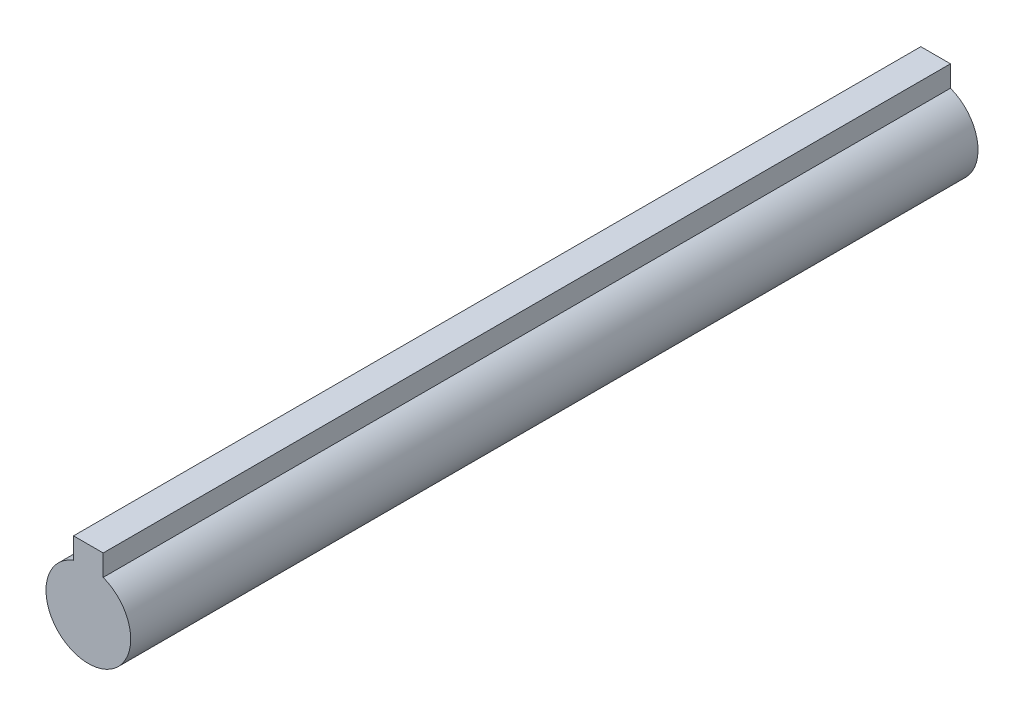
ISO-10303-21;
HEADER;
FILE_DESCRIPTION(('STEP AP214'),'2;1');
FILE_NAME('part.step','',(''),(''),'','','');
FILE_SCHEMA(('AUTOMOTIVE_DESIGN { 1 0 10303 214 1 1 1 1 }'));
ENDSEC;
DATA;
#1=APPLICATION_CONTEXT('core data for automotive mechanical design processes');
#2=APPLICATION_PROTOCOL_DEFINITION('international standard','automotive_design',2000,#1);
#3=PRODUCT_CONTEXT('',#1,'mechanical');
#4=PRODUCT('Part','Part','',(#3));
#5=PRODUCT_RELATED_PRODUCT_CATEGORY('part','',(#4));
#6=PRODUCT_DEFINITION_FORMATION('','',#4);
#7=PRODUCT_DEFINITION_CONTEXT('part definition',#1,'design');
#8=PRODUCT_DEFINITION('design','',#6,#7);
#9=PRODUCT_DEFINITION_SHAPE('','',#8);
#10=(LENGTH_UNIT() NAMED_UNIT(*) SI_UNIT(.MILLI.,.METRE.));
#11=(NAMED_UNIT(*) PLANE_ANGLE_UNIT() SI_UNIT($,.RADIAN.));
#12=(NAMED_UNIT(*) SI_UNIT($,.STERADIAN.) SOLID_ANGLE_UNIT());
#13=UNCERTAINTY_MEASURE_WITH_UNIT(LENGTH_MEASURE(1.E-05),#10,'distance_accuracy_value','');
#14=(GEOMETRIC_REPRESENTATION_CONTEXT(3) GLOBAL_UNCERTAINTY_ASSIGNED_CONTEXT((#13)) GLOBAL_UNIT_ASSIGNED_CONTEXT((#10,
#11,#12)) REPRESENTATION_CONTEXT('',''));
#15=CARTESIAN_POINT('',(0.,0.,0.));
#16=DIRECTION('',(0.,0.,1.));
#17=DIRECTION('',(1.,0.,0.));
#18=AXIS2_PLACEMENT_3D('',#15,#16,#17);
#19=CARTESIAN_POINT('',(-3.5,14.3674969975976,-100.));
#20=DIRECTION('',(-1.,0.,0.));
#21=DIRECTION('',(0.,0.,1.));
#22=AXIS2_PLACEMENT_3D('',#19,#20,#21);
#23=PLANE('',#22);
#24=DIRECTION('',(0.,-1.,0.));
#25=VECTOR('',#24,1.);
#26=CARTESIAN_POINT('',(-3.5,14.3674969975976,100.));
#27=LINE('',#26,#25);
#28=CARTESIAN_POINT('',(-3.5,14.3674969975976,100.));
#29=VERTEX_POINT('',#28);
#30=CARTESIAN_POINT('',(-3.5,9.3674969975976,100.));
#31=VERTEX_POINT('',#30);
#32=EDGE_CURVE('E100',#29,#31,#27,.T.);
#33=ORIENTED_EDGE('',*,*,#32,.F.);
#34=DIRECTION('',(0.,0.,1.));
#35=VECTOR('',#34,1.);
#36=CARTESIAN_POINT('',(-3.5,14.3674969975976,-100.));
#37=LINE('',#36,#35);
#38=CARTESIAN_POINT('',(-3.5,14.3674969975976,-100.));
#39=VERTEX_POINT('',#38);
#40=EDGE_CURVE('E11',#39,#29,#37,.T.);
#41=ORIENTED_EDGE('',*,*,#40,.F.);
#42=DIRECTION('',(0.,-1.,0.));
#43=VECTOR('',#42,1.);
#44=CARTESIAN_POINT('',(-3.5,14.3674969975976,-100.));
#45=LINE('',#44,#43);
#46=CARTESIAN_POINT('',(-3.5,9.3674969975976,-100.));
#47=VERTEX_POINT('',#46);
#48=EDGE_CURVE('E94',#39,#47,#45,.T.);
#49=ORIENTED_EDGE('',*,*,#48,.T.);
#50=DIRECTION('',(0.,0.,1.));
#51=VECTOR('',#50,1.);
#52=CARTESIAN_POINT('',(-3.5,9.3674969975976,-100.));
#53=LINE('',#52,#51);
#54=EDGE_CURVE('E39',#47,#31,#53,.T.);
#55=ORIENTED_EDGE('',*,*,#54,.T.);
#56=EDGE_LOOP('',(#33,#41,#49,#55));
#57=FACE_BOUND('',#56,.T.);
#58=ADVANCED_FACE('F36',(#57),#23,.T.);
#59=CARTESIAN_POINT('',(-3.5,14.3674969975976,-100.));
#60=DIRECTION('',(0.,1.,0.));
#61=DIRECTION('',(0.,0.,1.));
#62=AXIS2_PLACEMENT_3D('',#59,#60,#61);
#63=PLANE('',#62);
#64=DIRECTION('',(-1.,0.,0.));
#65=VECTOR('',#64,1.);
#66=CARTESIAN_POINT('',(-3.5,14.3674969975976,100.));
#67=LINE('',#66,#65);
#68=CARTESIAN_POINT('',(3.5,14.3674969975976,100.));
#69=VERTEX_POINT('',#68);
#70=EDGE_CURVE('E96',#69,#29,#67,.T.);
#71=ORIENTED_EDGE('',*,*,#70,.F.);
#72=DIRECTION('',(0.,0.,1.));
#73=VECTOR('',#72,1.);
#74=CARTESIAN_POINT('',(3.5,14.3674969975976,-100.));
#75=LINE('',#74,#73);
#76=CARTESIAN_POINT('',(3.5,14.3674969975976,-100.));
#77=VERTEX_POINT('',#76);
#78=EDGE_CURVE('E45',#77,#69,#75,.T.);
#79=ORIENTED_EDGE('',*,*,#78,.F.);
#80=DIRECTION('',(-1.,0.,0.));
#81=VECTOR('',#80,1.);
#82=CARTESIAN_POINT('',(-3.5,14.3674969975976,-100.));
#83=LINE('',#82,#81);
#84=EDGE_CURVE('E91',#77,#39,#83,.T.);
#85=ORIENTED_EDGE('',*,*,#84,.T.);
#86=ORIENTED_EDGE('',*,*,#40,.T.);
#87=EDGE_LOOP('',(#71,#79,#85,#86));
#88=FACE_BOUND('',#87,.T.);
#89=ADVANCED_FACE('F110',(#88),#63,.T.);
#90=CARTESIAN_POINT('',(3.5,14.3674969975976,-100.));
#91=DIRECTION('',(1.,0.,0.));
#92=DIRECTION('',(0.,0.,-1.));
#93=AXIS2_PLACEMENT_3D('',#90,#91,#92);
#94=PLANE('',#93);
#95=DIRECTION('',(0.,1.,0.));
#96=VECTOR('',#95,1.);
#97=CARTESIAN_POINT('',(3.5,14.3674969975976,100.));
#98=LINE('',#97,#96);
#99=CARTESIAN_POINT('',(3.5,9.3674969975976,100.));
#100=VERTEX_POINT('',#99);
#101=EDGE_CURVE('E86',#100,#69,#98,.T.);
#102=ORIENTED_EDGE('',*,*,#101,.F.);
#103=DIRECTION('',(0.,0.,1.));
#104=VECTOR('',#103,1.);
#105=CARTESIAN_POINT('',(3.5,9.3674969975976,-100.));
#106=LINE('',#105,#104);
#107=CARTESIAN_POINT('',(3.5,9.3674969975976,-100.));
#108=VERTEX_POINT('',#107);
#109=EDGE_CURVE('E81',#108,#100,#106,.T.);
#110=ORIENTED_EDGE('',*,*,#109,.F.);
#111=DIRECTION('',(0.,1.,0.));
#112=VECTOR('',#111,1.);
#113=CARTESIAN_POINT('',(3.5,14.3674969975976,-100.));
#114=LINE('',#113,#112);
#115=EDGE_CURVE('E84',#108,#77,#114,.T.);
#116=ORIENTED_EDGE('',*,*,#115,.T.);
#117=ORIENTED_EDGE('',*,*,#78,.T.);
#118=EDGE_LOOP('',(#102,#110,#116,#117));
#119=FACE_BOUND('',#118,.T.);
#120=ADVANCED_FACE('F83',(#119),#94,.T.);
#121=CARTESIAN_POINT('',(0.,0.,-100.));
#122=DIRECTION('',(0.,0.,1.));
#123=DIRECTION('',(1.,0.,0.));
#124=AXIS2_PLACEMENT_3D('',#121,#122,#123);
#125=CYLINDRICAL_SURFACE('',#124,10.);
#126=CARTESIAN_POINT('',(0.,0.,100.));
#127=DIRECTION('',(0.,0.,1.));
#128=DIRECTION('',(1.,0.,0.));
#129=AXIS2_PLACEMENT_3D('',#126,#127,#128);
#130=CIRCLE('',#129,10.);
#131=EDGE_CURVE('E103',#31,#100,#130,.T.);
#132=ORIENTED_EDGE('',*,*,#131,.F.);
#133=ORIENTED_EDGE('',*,*,#54,.F.);
#134=CARTESIAN_POINT('',(0.,0.,-100.));
#135=DIRECTION('',(0.,0.,1.));
#136=DIRECTION('',(1.,0.,0.));
#137=AXIS2_PLACEMENT_3D('',#134,#135,#136);
#138=CIRCLE('',#137,10.);
#139=EDGE_CURVE('E90',#47,#108,#138,.T.);
#140=ORIENTED_EDGE('',*,*,#139,.T.);
#141=ORIENTED_EDGE('',*,*,#109,.T.);
#142=EDGE_LOOP('',(#132,#133,#140,#141));
#143=FACE_BOUND('',#142,.T.);
#144=ADVANCED_FACE('F93',(#143),#125,.T.);
#145=CARTESIAN_POINT('',(0.,0.,-100.));
#146=DIRECTION('',(0.,0.,1.));
#147=DIRECTION('',(1.,0.,0.));
#148=AXIS2_PLACEMENT_3D('',#145,#146,#147);
#149=PLANE('',#148);
#150=ORIENTED_EDGE('',*,*,#48,.F.);
#151=ORIENTED_EDGE('',*,*,#84,.F.);
#152=ORIENTED_EDGE('',*,*,#115,.F.);
#153=ORIENTED_EDGE('',*,*,#139,.F.);
#154=EDGE_LOOP('',(#150,#151,#152,#153));
#155=FACE_BOUND('',#154,.T.);
#156=ADVANCED_FACE('F89',(#155),#149,.F.);
#157=CARTESIAN_POINT('',(0.,0.,100.));
#158=DIRECTION('',(0.,0.,1.));
#159=DIRECTION('',(1.,0.,0.));
#160=AXIS2_PLACEMENT_3D('',#157,#158,#159);
#161=PLANE('',#160);
#162=ORIENTED_EDGE('',*,*,#32,.T.);
#163=ORIENTED_EDGE('',*,*,#131,.T.);
#164=ORIENTED_EDGE('',*,*,#101,.T.);
#165=ORIENTED_EDGE('',*,*,#70,.T.);
#166=EDGE_LOOP('',(#162,#163,#164,#165));
#167=FACE_BOUND('',#166,.T.);
#168=ADVANCED_FACE('F109',(#167),#161,.T.);
#169=CLOSED_SHELL('',(#58,#89,#120,#144,#156,#168));
#170=MANIFOLD_SOLID_BREP('B2',#169);
#171=ADVANCED_BREP_SHAPE_REPRESENTATION('',(#18,#170),#14);
#172=SHAPE_DEFINITION_REPRESENTATION(#9,#171);
ENDSEC;
END-ISO-10303-21;
